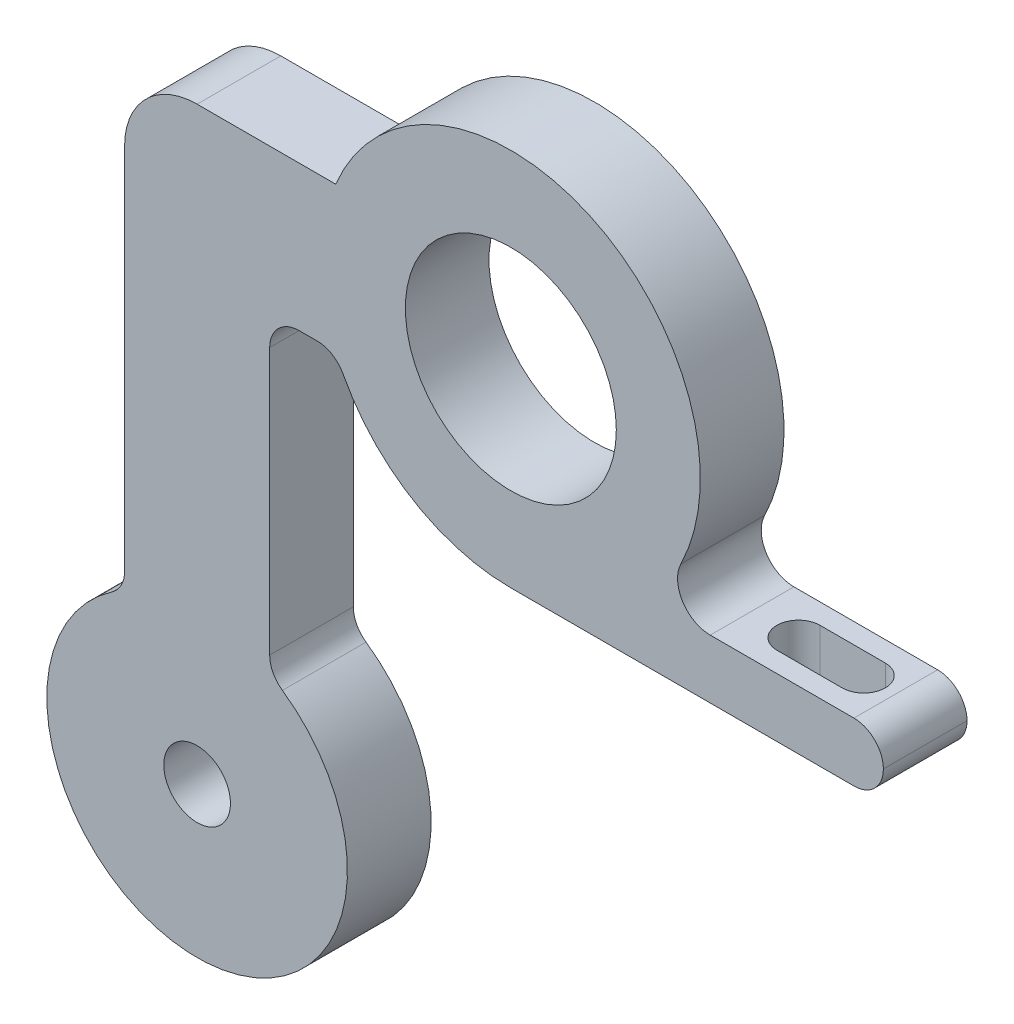
ISO-10303-21;
HEADER;
FILE_DESCRIPTION(('STEP AP214'),'2;1');
FILE_NAME('part.step','',(''),(''),'','','');
FILE_SCHEMA(('AUTOMOTIVE_DESIGN { 1 0 10303 214 1 1 1 1 }'));
ENDSEC;
DATA;
#1=APPLICATION_CONTEXT('core data for automotive mechanical design processes');
#2=APPLICATION_PROTOCOL_DEFINITION('international standard','automotive_design',2000,#1);
#3=PRODUCT_CONTEXT('',#1,'mechanical');
#4=PRODUCT('Part','Part','',(#3));
#5=PRODUCT_RELATED_PRODUCT_CATEGORY('part','',(#4));
#6=PRODUCT_DEFINITION_FORMATION('','',#4);
#7=PRODUCT_DEFINITION_CONTEXT('part definition',#1,'design');
#8=PRODUCT_DEFINITION('design','',#6,#7);
#9=PRODUCT_DEFINITION_SHAPE('','',#8);
#10=(LENGTH_UNIT() NAMED_UNIT(*) SI_UNIT(.MILLI.,.METRE.));
#11=(NAMED_UNIT(*) PLANE_ANGLE_UNIT() SI_UNIT($,.RADIAN.));
#12=(NAMED_UNIT(*) SI_UNIT($,.STERADIAN.) SOLID_ANGLE_UNIT());
#13=UNCERTAINTY_MEASURE_WITH_UNIT(LENGTH_MEASURE(1.E-05),#10,'distance_accuracy_value','');
#14=(GEOMETRIC_REPRESENTATION_CONTEXT(3) GLOBAL_UNCERTAINTY_ASSIGNED_CONTEXT((#13)) GLOBAL_UNIT_ASSIGNED_CONTEXT((#10,
#11,#12)) REPRESENTATION_CONTEXT('',''));
#15=CARTESIAN_POINT('',(0.,0.,0.));
#16=DIRECTION('',(0.,0.,1.));
#17=DIRECTION('',(1.,0.,0.));
#18=AXIS2_PLACEMENT_3D('',#15,#16,#17);
#19=CARTESIAN_POINT('',(0.,0.,6.4));
#20=DIRECTION('',(0.,0.,-1.));
#21=DIRECTION('',(-1.,0.,0.));
#22=AXIS2_PLACEMENT_3D('',#19,#20,#21);
#23=CYLINDRICAL_SURFACE('',#22,11.5);
#24=CARTESIAN_POINT('',(0.,0.,6.4));
#25=DIRECTION('',(0.,0.,1.));
#26=DIRECTION('',(1.,0.,0.));
#27=AXIS2_PLACEMENT_3D('',#24,#25,#26);
#28=CIRCLE('',#27,11.5);
#29=CARTESIAN_POINT('',(-6.52363636363636,9.47059494409096,6.4));
#30=VERTEX_POINT('',#29);
#31=CARTESIAN_POINT('',(6.52363636363636,9.47059494409096,6.4));
#32=VERTEX_POINT('',#31);
#33=EDGE_CURVE('E223',#30,#32,#28,.T.);
#34=ORIENTED_EDGE('',*,*,#33,.F.);
#35=DIRECTION('',(0.,0.,-1.));
#36=VECTOR('',#35,1.);
#37=CARTESIAN_POINT('',(-6.52363636363636,9.47059494409096,6.4));
#38=LINE('',#37,#36);
#39=CARTESIAN_POINT('',(-6.52363636363636,9.47059494409096,0.));
#40=VERTEX_POINT('',#39);
#41=EDGE_CURVE('E312',#30,#40,#38,.T.);
#42=ORIENTED_EDGE('',*,*,#41,.T.);
#43=CARTESIAN_POINT('',(0.,0.,0.));
#44=DIRECTION('',(0.,0.,1.));
#45=DIRECTION('',(1.,0.,0.));
#46=AXIS2_PLACEMENT_3D('',#43,#44,#45);
#47=CIRCLE('',#46,11.5);
#48=CARTESIAN_POINT('',(6.52363636363636,9.47059494409096,0.));
#49=VERTEX_POINT('',#48);
#50=EDGE_CURVE('E254',#40,#49,#47,.T.);
#51=ORIENTED_EDGE('',*,*,#50,.T.);
#52=DIRECTION('',(0.,0.,-1.));
#53=VECTOR('',#52,1.);
#54=CARTESIAN_POINT('',(6.52363636363636,9.47059494409096,6.4));
#55=LINE('',#54,#53);
#56=EDGE_CURVE('E310',#49,#32,#55,.F.);
#57=ORIENTED_EDGE('',*,*,#56,.T.);
#58=EDGE_LOOP('',(#34,#42,#51,#57));
#59=FACE_BOUND('',#58,.T.);
#60=ADVANCED_FACE('F34',(#59),#23,.T.);
#61=CARTESIAN_POINT('',(5.55,0.,6.4));
#62=DIRECTION('',(-1.,0.,0.));
#63=DIRECTION('',(0.,-1.,0.));
#64=AXIS2_PLACEMENT_3D('',#61,#62,#63);
#65=PLANE('',#64);
#66=DIRECTION('',(0.,1.,0.));
#67=VECTOR('',#66,1.);
#68=CARTESIAN_POINT('',(5.55,0.,6.4));
#69=LINE('',#68,#67);
#70=CARTESIAN_POINT('',(5.55,11.3235374331522,6.4));
#71=VERTEX_POINT('',#70);
#72=CARTESIAN_POINT('',(5.55,31.7,6.4));
#73=VERTEX_POINT('',#72);
#74=EDGE_CURVE('E227',#71,#73,#69,.T.);
#75=ORIENTED_EDGE('',*,*,#74,.F.);
#76=DIRECTION('',(0.,0.,1.));
#77=VECTOR('',#76,1.);
#78=CARTESIAN_POINT('',(5.55,11.3235374331522,0.));
#79=LINE('',#78,#77);
#80=CARTESIAN_POINT('',(5.55,11.3235374331522,0.));
#81=VERTEX_POINT('',#80);
#82=EDGE_CURVE('E319',#71,#81,#79,.F.);
#83=ORIENTED_EDGE('',*,*,#82,.T.);
#84=DIRECTION('',(0.,1.,0.));
#85=VECTOR('',#84,1.);
#86=CARTESIAN_POINT('',(5.55,0.,0.));
#87=LINE('',#86,#85);
#88=CARTESIAN_POINT('',(5.55,31.7,0.));
#89=VERTEX_POINT('',#88);
#90=EDGE_CURVE('E257',#81,#89,#87,.T.);
#91=ORIENTED_EDGE('',*,*,#90,.T.);
#92=DIRECTION('',(0.,0.,-1.));
#93=VECTOR('',#92,1.);
#94=CARTESIAN_POINT('',(5.55,31.7,6.4));
#95=LINE('',#94,#93);
#96=EDGE_CURVE('E317',#89,#73,#95,.F.);
#97=ORIENTED_EDGE('',*,*,#96,.T.);
#98=EDGE_LOOP('',(#75,#83,#91,#97));
#99=FACE_BOUND('',#98,.T.);
#100=ADVANCED_FACE('F355',(#99),#65,.F.);
#101=CARTESIAN_POINT('',(0.,33.95,6.4));
#102=DIRECTION('',(0.,1.,0.));
#103=DIRECTION('',(0.,0.,1.));
#104=AXIS2_PLACEMENT_3D('',#101,#102,#103);
#105=PLANE('',#104);
#106=DIRECTION('',(1.,0.,0.));
#107=VECTOR('',#106,1.);
#108=CARTESIAN_POINT('',(0.,33.95,0.));
#109=LINE('',#108,#107);
#110=CARTESIAN_POINT('',(7.8,33.95,0.));
#111=VERTEX_POINT('',#110);
#112=CARTESIAN_POINT('',(9.17696050062606,33.95,0.));
#113=VERTEX_POINT('',#112);
#114=EDGE_CURVE('E260',#111,#113,#109,.T.);
#115=ORIENTED_EDGE('',*,*,#114,.T.);
#116=DIRECTION('',(0.,0.,1.));
#117=VECTOR('',#116,1.);
#118=CARTESIAN_POINT('',(9.17696050062606,33.95,6.4));
#119=LINE('',#118,#117);
#120=CARTESIAN_POINT('',(9.17696050062606,33.95,6.4));
#121=VERTEX_POINT('',#120);
#122=EDGE_CURVE('E308',#113,#121,#119,.T.);
#123=ORIENTED_EDGE('',*,*,#122,.T.);
#124=DIRECTION('',(1.,0.,0.));
#125=VECTOR('',#124,1.);
#126=CARTESIAN_POINT('',(0.,33.95,6.4));
#127=LINE('',#126,#125);
#128=CARTESIAN_POINT('',(7.8,33.95,6.4));
#129=VERTEX_POINT('',#128);
#130=EDGE_CURVE('E230',#129,#121,#127,.T.);
#131=ORIENTED_EDGE('',*,*,#130,.F.);
#132=DIRECTION('',(0.,0.,-1.));
#133=VECTOR('',#132,1.);
#134=CARTESIAN_POINT('',(7.8,33.95,0.));
#135=LINE('',#134,#133);
#136=EDGE_CURVE('E305',#129,#111,#135,.T.);
#137=ORIENTED_EDGE('',*,*,#136,.T.);
#138=EDGE_LOOP('',(#115,#123,#131,#137));
#139=FACE_BOUND('',#138,.T.);
#140=ADVANCED_FACE('F364',(#139),#105,.F.);
#141=CARTESIAN_POINT('',(24.,39.5,6.4));
#142=DIRECTION('',(0.,0.,-1.));
#143=DIRECTION('',(-1.,0.,0.));
#144=AXIS2_PLACEMENT_3D('',#141,#142,#143);
#145=CYLINDRICAL_SURFACE('',#144,14.5);
#146=CARTESIAN_POINT('',(24.,39.5,6.4));
#147=DIRECTION('',(0.,0.,1.));
#148=DIRECTION('',(1.,0.,0.));
#149=AXIS2_PLACEMENT_3D('',#146,#147,#148);
#150=CIRCLE('',#149,14.5);
#151=CARTESIAN_POINT('',(11.1681150602435,32.7477611940298,6.4));
#152=VERTEX_POINT('',#151);
#153=CARTESIAN_POINT('',(24.,25.,6.4));
#154=VERTEX_POINT('',#153);
#155=EDGE_CURVE('E233',#152,#154,#150,.T.);
#156=ORIENTED_EDGE('',*,*,#155,.F.);
#157=DIRECTION('',(0.,0.,-1.));
#158=VECTOR('',#157,1.);
#159=CARTESIAN_POINT('',(11.1681150602435,32.7477611940298,6.4));
#160=LINE('',#159,#158);
#161=CARTESIAN_POINT('',(11.1681150602435,32.7477611940298,0.));
#162=VERTEX_POINT('',#161);
#163=EDGE_CURVE('E302',#152,#162,#160,.T.);
#164=ORIENTED_EDGE('',*,*,#163,.T.);
#165=CARTESIAN_POINT('',(24.,39.5,0.));
#166=DIRECTION('',(0.,0.,1.));
#167=DIRECTION('',(1.,0.,0.));
#168=AXIS2_PLACEMENT_3D('',#165,#166,#167);
#169=CIRCLE('',#168,14.5);
#170=CARTESIAN_POINT('',(24.,25.,0.));
#171=VERTEX_POINT('',#170);
#172=EDGE_CURVE('E263',#162,#171,#169,.T.);
#173=ORIENTED_EDGE('',*,*,#172,.T.);
#174=DIRECTION('',(0.,0.,-1.));
#175=VECTOR('',#174,1.);
#176=CARTESIAN_POINT('',(24.,25.,6.4));
#177=LINE('',#176,#175);
#178=EDGE_CURVE('E288',#154,#171,#177,.T.);
#179=ORIENTED_EDGE('',*,*,#178,.F.);
#180=EDGE_LOOP('',(#156,#164,#173,#179));
#181=FACE_BOUND('',#180,.T.);
#182=ADVANCED_FACE('F372',(#181),#145,.T.);
#183=CARTESIAN_POINT('',(0.,25.,6.4));
#184=DIRECTION('',(0.,1.,0.));
#185=DIRECTION('',(0.,0.,1.));
#186=AXIS2_PLACEMENT_3D('',#183,#184,#185);
#187=PLANE('',#186);
#188=DIRECTION('',(-1.,0.,0.));
#189=VECTOR('',#188,1.);
#190=CARTESIAN_POINT('',(0.,25.,1.55000000000001));
#191=LINE('',#190,#189);
#192=CARTESIAN_POINT('',(47.8,25.,1.55));
#193=VERTEX_POINT('',#192);
#194=CARTESIAN_POINT('',(42.8,25.,1.55));
#195=VERTEX_POINT('',#194);
#196=EDGE_CURVE('E213',#193,#195,#191,.T.);
#197=ORIENTED_EDGE('',*,*,#196,.T.);
#198=CARTESIAN_POINT('',(42.8,25.,3.2));
#199=DIRECTION('',(0.,1.,0.));
#200=DIRECTION('',(0.,0.,1.));
#201=AXIS2_PLACEMENT_3D('',#198,#199,#200);
#202=CIRCLE('',#201,1.65);
#203=CARTESIAN_POINT('',(42.8,25.,4.85));
#204=VERTEX_POINT('',#203);
#205=EDGE_CURVE('E216',#195,#204,#202,.T.);
#206=ORIENTED_EDGE('',*,*,#205,.T.);
#207=DIRECTION('',(1.,0.,0.));
#208=VECTOR('',#207,1.);
#209=CARTESIAN_POINT('',(0.,25.,4.85000000000001));
#210=LINE('',#209,#208);
#211=CARTESIAN_POINT('',(47.8,25.,4.85));
#212=VERTEX_POINT('',#211);
#213=EDGE_CURVE('E208',#204,#212,#210,.T.);
#214=ORIENTED_EDGE('',*,*,#213,.T.);
#215=CARTESIAN_POINT('',(47.8,25.,3.2));
#216=DIRECTION('',(0.,1.,0.));
#217=DIRECTION('',(0.,0.,1.));
#218=AXIS2_PLACEMENT_3D('',#215,#216,#217);
#219=CIRCLE('',#218,1.65);
#220=EDGE_CURVE('E183',#212,#193,#219,.T.);
#221=ORIENTED_EDGE('',*,*,#220,.T.);
#222=EDGE_LOOP('',(#197,#206,#214,#221));
#223=FACE_BOUND('',#222,.T.);
#224=DIRECTION('',(1.,0.,0.));
#225=VECTOR('',#224,1.);
#226=CARTESIAN_POINT('',(0.,25.,0.));
#227=LINE('',#226,#225);
#228=CARTESIAN_POINT('',(50.25,25.,0.));
#229=VERTEX_POINT('',#228);
#230=EDGE_CURVE('E265',#171,#229,#227,.T.);
#231=ORIENTED_EDGE('',*,*,#230,.T.);
#232=DIRECTION('',(0.,0.,-1.));
#233=VECTOR('',#232,1.);
#234=CARTESIAN_POINT('',(50.25,25.,6.4));
#235=LINE('',#234,#233);
#236=CARTESIAN_POINT('',(50.25,25.,6.4));
#237=VERTEX_POINT('',#236);
#238=EDGE_CURVE('E326',#229,#237,#235,.F.);
#239=ORIENTED_EDGE('',*,*,#238,.T.);
#240=DIRECTION('',(1.,0.,0.));
#241=VECTOR('',#240,1.);
#242=CARTESIAN_POINT('',(0.,25.,6.4));
#243=LINE('',#242,#241);
#244=EDGE_CURVE('E235',#154,#237,#243,.T.);
#245=ORIENTED_EDGE('',*,*,#244,.F.);
#246=ORIENTED_EDGE('',*,*,#178,.T.);
#247=EDGE_LOOP('',(#231,#239,#245,#246));
#248=FACE_BOUND('',#247,.T.);
#249=ADVANCED_FACE('F377',(#223,#248),#187,.F.);
#250=CARTESIAN_POINT('',(0.,29.5,6.4));
#251=DIRECTION('',(0.,-1.,0.));
#252=DIRECTION('',(1.,0.,0.));
#253=AXIS2_PLACEMENT_3D('',#250,#251,#252);
#254=PLANE('',#253);
#255=DIRECTION('',(1.,0.,0.));
#256=VECTOR('',#255,1.);
#257=CARTESIAN_POINT('',(42.8,29.5,4.85));
#258=LINE('',#257,#256);
#259=CARTESIAN_POINT('',(42.8,29.5,4.85));
#260=VERTEX_POINT('',#259);
#261=CARTESIAN_POINT('',(47.8,29.5,4.85));
#262=VERTEX_POINT('',#261);
#263=EDGE_CURVE('E191',#260,#262,#258,.T.);
#264=ORIENTED_EDGE('',*,*,#263,.F.);
#265=CARTESIAN_POINT('',(42.8,29.5,3.2));
#266=DIRECTION('',(0.,1.,0.));
#267=DIRECTION('',(-1.,0.,0.));
#268=AXIS2_PLACEMENT_3D('',#265,#266,#267);
#269=CIRCLE('',#268,1.65);
#270=CARTESIAN_POINT('',(42.8,29.5,1.55));
#271=VERTEX_POINT('',#270);
#272=EDGE_CURVE('E196',#271,#260,#269,.T.);
#273=ORIENTED_EDGE('',*,*,#272,.F.);
#274=DIRECTION('',(-1.,0.,0.));
#275=VECTOR('',#274,1.);
#276=CARTESIAN_POINT('',(42.8,29.5,1.55));
#277=LINE('',#276,#275);
#278=CARTESIAN_POINT('',(47.8,29.5,1.55));
#279=VERTEX_POINT('',#278);
#280=EDGE_CURVE('E201',#279,#271,#277,.T.);
#281=ORIENTED_EDGE('',*,*,#280,.F.);
#282=CARTESIAN_POINT('',(47.8,29.5,3.2));
#283=DIRECTION('',(0.,1.,0.));
#284=DIRECTION('',(-1.,0.,0.));
#285=AXIS2_PLACEMENT_3D('',#282,#283,#284);
#286=CIRCLE('',#285,1.65);
#287=EDGE_CURVE('E180',#262,#279,#286,.T.);
#288=ORIENTED_EDGE('',*,*,#287,.F.);
#289=EDGE_LOOP('',(#264,#273,#281,#288));
#290=FACE_BOUND('',#289,.T.);
#291=DIRECTION('',(-1.,0.,0.));
#292=VECTOR('',#291,1.);
#293=CARTESIAN_POINT('',(0.,29.5,6.4));
#294=LINE('',#293,#292);
#295=CARTESIAN_POINT('',(50.25,29.5,6.4));
#296=VERTEX_POINT('',#295);
#297=CARTESIAN_POINT('',(39.2561463023924,29.5,6.4));
#298=VERTEX_POINT('',#297);
#299=EDGE_CURVE('E238',#296,#298,#294,.T.);
#300=ORIENTED_EDGE('',*,*,#299,.F.);
#301=DIRECTION('',(0.,0.,-1.));
#302=VECTOR('',#301,1.);
#303=CARTESIAN_POINT('',(50.25,29.5,6.4));
#304=LINE('',#303,#302);
#305=CARTESIAN_POINT('',(50.25,29.5,0.));
#306=VERTEX_POINT('',#305);
#307=EDGE_CURVE('E331',#296,#306,#304,.T.);
#308=ORIENTED_EDGE('',*,*,#307,.T.);
#309=DIRECTION('',(-1.,0.,0.));
#310=VECTOR('',#309,1.);
#311=CARTESIAN_POINT('',(0.,29.5,0.));
#312=LINE('',#311,#310);
#313=CARTESIAN_POINT('',(39.2561463023924,29.5,0.));
#314=VERTEX_POINT('',#313);
#315=EDGE_CURVE('E269',#306,#314,#312,.T.);
#316=ORIENTED_EDGE('',*,*,#315,.T.);
#317=DIRECTION('',(0.,0.,1.));
#318=VECTOR('',#317,1.);
#319=CARTESIAN_POINT('',(39.2561463023924,29.5,6.4));
#320=LINE('',#319,#318);
#321=EDGE_CURVE('E294',#314,#298,#320,.T.);
#322=ORIENTED_EDGE('',*,*,#321,.T.);
#323=EDGE_LOOP('',(#300,#308,#316,#322));
#324=FACE_BOUND('',#323,.T.);
#325=ADVANCED_FACE('F198',(#290,#324),#254,.F.);
#326=CARTESIAN_POINT('',(37.0125953755699,33.1029411764706,6.4));
#327=VERTEX_POINT('',#326);
#328=CARTESIAN_POINT('',(10.6041984189075,45.05,6.4));
#329=VERTEX_POINT('',#328);
#330=EDGE_CURVE('E236',#327,#329,#150,.T.);
#331=ORIENTED_EDGE('',*,*,#330,.F.);
#332=DIRECTION('',(0.,0.,-1.));
#333=VECTOR('',#332,1.);
#334=CARTESIAN_POINT('',(37.0125953755699,33.1029411764706,6.4));
#335=LINE('',#334,#333);
#336=CARTESIAN_POINT('',(37.0125953755699,33.1029411764706,0.));
#337=VERTEX_POINT('',#336);
#338=EDGE_CURVE('E291',#327,#337,#335,.T.);
#339=ORIENTED_EDGE('',*,*,#338,.T.);
#340=CARTESIAN_POINT('',(10.6041984189075,45.05,0.));
#341=VERTEX_POINT('',#340);
#342=EDGE_CURVE('E266',#337,#341,#169,.T.);
#343=ORIENTED_EDGE('',*,*,#342,.T.);
#344=DIRECTION('',(0.,0.,-1.));
#345=VECTOR('',#344,1.);
#346=CARTESIAN_POINT('',(10.6041984189075,45.05,6.4));
#347=LINE('',#346,#345);
#348=EDGE_CURVE('E285',#329,#341,#347,.T.);
#349=ORIENTED_EDGE('',*,*,#348,.F.);
#350=EDGE_LOOP('',(#331,#339,#343,#349));
#351=FACE_BOUND('',#350,.T.);
#352=ADVANCED_FACE('F398',(#351),#145,.T.);
#353=CARTESIAN_POINT('',(0.,45.05,6.4));
#354=DIRECTION('',(0.,1.,0.));
#355=DIRECTION('',(0.,0.,1.));
#356=AXIS2_PLACEMENT_3D('',#353,#354,#355);
#357=PLANE('',#356);
#358=DIRECTION('',(1.,0.,0.));
#359=VECTOR('',#358,1.);
#360=CARTESIAN_POINT('',(0.,45.05,0.));
#361=LINE('',#360,#359);
#362=CARTESIAN_POINT('',(0.,45.05,0.));
#363=VERTEX_POINT('',#362);
#364=EDGE_CURVE('E271',#363,#341,#361,.T.);
#365=ORIENTED_EDGE('',*,*,#364,.F.);
#366=DIRECTION('',(0.,0.,-1.));
#367=VECTOR('',#366,1.);
#368=CARTESIAN_POINT('',(0.,45.05,6.4));
#369=LINE('',#368,#367);
#370=CARTESIAN_POINT('',(0.,45.05,6.4));
#371=VERTEX_POINT('',#370);
#372=EDGE_CURVE('E283',#371,#363,#369,.T.);
#373=ORIENTED_EDGE('',*,*,#372,.F.);
#374=DIRECTION('',(1.,0.,0.));
#375=VECTOR('',#374,1.);
#376=CARTESIAN_POINT('',(0.,45.05,6.4));
#377=LINE('',#376,#375);
#378=EDGE_CURVE('E240',#371,#329,#377,.T.);
#379=ORIENTED_EDGE('',*,*,#378,.T.);
#380=ORIENTED_EDGE('',*,*,#348,.T.);
#381=EDGE_LOOP('',(#365,#373,#379,#380));
#382=FACE_BOUND('',#381,.T.);
#383=ADVANCED_FACE('F450',(#382),#357,.T.);
#384=CARTESIAN_POINT('',(0.,39.5,6.4));
#385=DIRECTION('',(0.,0.,-1.));
#386=DIRECTION('',(-1.,0.,0.));
#387=AXIS2_PLACEMENT_3D('',#384,#385,#386);
#388=CYLINDRICAL_SURFACE('',#387,5.55);
#389=CARTESIAN_POINT('',(0.,39.5,0.));
#390=DIRECTION('',(0.,0.,1.));
#391=DIRECTION('',(1.,0.,0.));
#392=AXIS2_PLACEMENT_3D('',#389,#390,#391);
#393=CIRCLE('',#392,5.55);
#394=CARTESIAN_POINT('',(-5.55,39.5,0.));
#395=VERTEX_POINT('',#394);
#396=EDGE_CURVE('E274',#363,#395,#393,.T.);
#397=ORIENTED_EDGE('',*,*,#396,.T.);
#398=DIRECTION('',(0.,0.,-1.));
#399=VECTOR('',#398,1.);
#400=CARTESIAN_POINT('',(-5.55,39.5,6.4));
#401=LINE('',#400,#399);
#402=CARTESIAN_POINT('',(-5.55,39.5,6.4));
#403=VERTEX_POINT('',#402);
#404=EDGE_CURVE('E251',#403,#395,#401,.T.);
#405=ORIENTED_EDGE('',*,*,#404,.F.);
#406=CARTESIAN_POINT('',(0.,39.5,6.4));
#407=DIRECTION('',(0.,0.,1.));
#408=DIRECTION('',(1.,0.,0.));
#409=AXIS2_PLACEMENT_3D('',#406,#407,#408);
#410=CIRCLE('',#409,5.55);
#411=EDGE_CURVE('E243',#371,#403,#410,.T.);
#412=ORIENTED_EDGE('',*,*,#411,.F.);
#413=ORIENTED_EDGE('',*,*,#372,.T.);
#414=EDGE_LOOP('',(#397,#405,#412,#413));
#415=FACE_BOUND('',#414,.T.);
#416=ADVANCED_FACE('F456',(#415),#388,.T.);
#417=CARTESIAN_POINT('',(-5.55,0.,6.4));
#418=DIRECTION('',(-1.,0.,0.));
#419=DIRECTION('',(0.,-1.,0.));
#420=AXIS2_PLACEMENT_3D('',#417,#418,#419);
#421=PLANE('',#420);
#422=DIRECTION('',(0.,1.,0.));
#423=VECTOR('',#422,1.);
#424=CARTESIAN_POINT('',(-5.55,0.,0.));
#425=LINE('',#424,#423);
#426=CARTESIAN_POINT('',(-5.55,11.3235374331522,0.));
#427=VERTEX_POINT('',#426);
#428=EDGE_CURVE('E277',#427,#395,#425,.T.);
#429=ORIENTED_EDGE('',*,*,#428,.F.);
#430=DIRECTION('',(0.,0.,-1.));
#431=VECTOR('',#430,1.);
#432=CARTESIAN_POINT('',(-5.55,11.3235374331522,6.4));
#433=LINE('',#432,#431);
#434=CARTESIAN_POINT('',(-5.55,11.3235374331522,6.4));
#435=VERTEX_POINT('',#434);
#436=EDGE_CURVE('E315',#427,#435,#433,.F.);
#437=ORIENTED_EDGE('',*,*,#436,.T.);
#438=DIRECTION('',(0.,1.,0.));
#439=VECTOR('',#438,1.);
#440=CARTESIAN_POINT('',(-5.55,0.,6.4));
#441=LINE('',#440,#439);
#442=EDGE_CURVE('E246',#435,#403,#441,.T.);
#443=ORIENTED_EDGE('',*,*,#442,.T.);
#444=ORIENTED_EDGE('',*,*,#404,.T.);
#445=EDGE_LOOP('',(#429,#437,#443,#444));
#446=FACE_BOUND('',#445,.T.);
#447=ADVANCED_FACE('F415',(#446),#421,.T.);
#448=CARTESIAN_POINT('',(24.,39.5,6.4));
#449=DIRECTION('',(0.,0.,-1.));
#450=DIRECTION('',(-1.,0.,0.));
#451=AXIS2_PLACEMENT_3D('',#448,#449,#450);
#452=CYLINDRICAL_SURFACE('',#451,8.07);
#453=CARTESIAN_POINT('',(24.,39.5,6.4));
#454=DIRECTION('',(0.,0.,1.));
#455=DIRECTION('',(1.,0.,0.));
#456=AXIS2_PLACEMENT_3D('',#453,#454,#455);
#457=CIRCLE('',#456,8.07);
#458=CARTESIAN_POINT('',(32.07,39.5,6.4));
#459=VERTEX_POINT('',#458);
#460=EDGE_CURVE('E220',#459,#459,#457,.T.);
#461=ORIENTED_EDGE('',*,*,#460,.T.);
#462=EDGE_LOOP('',(#461));
#463=FACE_BOUND('',#462,.T.);
#464=CARTESIAN_POINT('',(24.,39.5,0.));
#465=DIRECTION('',(0.,0.,1.));
#466=DIRECTION('',(1.,0.,0.));
#467=AXIS2_PLACEMENT_3D('',#464,#465,#466);
#468=CIRCLE('',#467,8.07);
#469=CARTESIAN_POINT('',(32.07,39.5,0.));
#470=VERTEX_POINT('',#469);
#471=EDGE_CURVE('E219',#470,#470,#468,.T.);
#472=ORIENTED_EDGE('',*,*,#471,.F.);
#473=EDGE_LOOP('',(#472));
#474=FACE_BOUND('',#473,.T.);
#475=ADVANCED_FACE('F411',(#463,#474),#452,.F.);
#476=CARTESIAN_POINT('',(0.,0.,6.4));
#477=DIRECTION('',(0.,0.,-1.));
#478=DIRECTION('',(-1.,0.,0.));
#479=AXIS2_PLACEMENT_3D('',#476,#477,#478);
#480=CYLINDRICAL_SURFACE('',#479,2.55);
#481=CARTESIAN_POINT('',(0.,0.,6.4));
#482=DIRECTION('',(0.,0.,1.));
#483=DIRECTION('',(1.,0.,0.));
#484=AXIS2_PLACEMENT_3D('',#481,#482,#483);
#485=CIRCLE('',#484,2.55);
#486=CARTESIAN_POINT('',(2.55,0.,6.4));
#487=VERTEX_POINT('',#486);
#488=EDGE_CURVE('E248',#487,#487,#485,.T.);
#489=ORIENTED_EDGE('',*,*,#488,.T.);
#490=EDGE_LOOP('',(#489));
#491=FACE_BOUND('',#490,.T.);
#492=CARTESIAN_POINT('',(0.,0.,0.));
#493=DIRECTION('',(0.,0.,1.));
#494=DIRECTION('',(1.,0.,0.));
#495=AXIS2_PLACEMENT_3D('',#492,#493,#494);
#496=CIRCLE('',#495,2.55);
#497=CARTESIAN_POINT('',(2.55,0.,0.));
#498=VERTEX_POINT('',#497);
#499=EDGE_CURVE('E224',#498,#498,#496,.T.);
#500=ORIENTED_EDGE('',*,*,#499,.F.);
#501=EDGE_LOOP('',(#500));
#502=FACE_BOUND('',#501,.T.);
#503=ADVANCED_FACE('F414',(#491,#502),#480,.F.);
#504=CARTESIAN_POINT('',(0.,0.,6.4));
#505=DIRECTION('',(0.,0.,1.));
#506=DIRECTION('',(1.,0.,0.));
#507=AXIS2_PLACEMENT_3D('',#504,#505,#506);
#508=PLANE('',#507);
#509=ORIENTED_EDGE('',*,*,#460,.F.);
#510=EDGE_LOOP('',(#509));
#511=FACE_BOUND('',#510,.T.);
#512=ORIENTED_EDGE('',*,*,#244,.T.);
#513=CARTESIAN_POINT('',(50.25,27.25,6.4));
#514=DIRECTION('',(0.,0.,1.));
#515=DIRECTION('',(1.,0.,0.));
#516=AXIS2_PLACEMENT_3D('',#513,#514,#515);
#517=CIRCLE('',#516,2.25);
#518=CARTESIAN_POINT('',(52.5,27.25,6.4));
#519=VERTEX_POINT('',#518);
#520=EDGE_CURVE('E55',#237,#519,#517,.T.);
#521=ORIENTED_EDGE('',*,*,#520,.T.);
#522=CARTESIAN_POINT('',(50.25,27.25,6.4));
#523=DIRECTION('',(0.,0.,1.));
#524=DIRECTION('',(1.,0.,0.));
#525=AXIS2_PLACEMENT_3D('',#522,#523,#524);
#526=CIRCLE('',#525,2.25);
#527=EDGE_CURVE('E50',#519,#296,#526,.T.);
#528=ORIENTED_EDGE('',*,*,#527,.T.);
#529=ORIENTED_EDGE('',*,*,#299,.T.);
#530=CARTESIAN_POINT('',(39.2561463023924,32.,6.4));
#531=DIRECTION('',(0.,0.,1.));
#532=DIRECTION('',(1.,0.,0.));
#533=AXIS2_PLACEMENT_3D('',#530,#531,#532);
#534=CIRCLE('',#533,2.5);
#535=EDGE_CURVE('E300',#298,#327,#534,.F.);
#536=ORIENTED_EDGE('',*,*,#535,.T.);
#537=ORIENTED_EDGE('',*,*,#330,.T.);
#538=ORIENTED_EDGE('',*,*,#378,.F.);
#539=ORIENTED_EDGE('',*,*,#411,.T.);
#540=ORIENTED_EDGE('',*,*,#442,.F.);
#541=CARTESIAN_POINT('',(-7.8,11.3235374331522,6.4));
#542=DIRECTION('',(0.,0.,1.));
#543=DIRECTION('',(1.,0.,0.));
#544=AXIS2_PLACEMENT_3D('',#541,#542,#543);
#545=CIRCLE('',#544,2.25);
#546=EDGE_CURVE('E339',#435,#30,#545,.F.);
#547=ORIENTED_EDGE('',*,*,#546,.T.);
#548=ORIENTED_EDGE('',*,*,#33,.T.);
#549=CARTESIAN_POINT('',(7.8,11.3235374331522,6.4));
#550=DIRECTION('',(0.,0.,1.));
#551=DIRECTION('',(1.,0.,0.));
#552=AXIS2_PLACEMENT_3D('',#549,#550,#551);
#553=CIRCLE('',#552,2.25);
#554=EDGE_CURVE('E343',#32,#71,#553,.F.);
#555=ORIENTED_EDGE('',*,*,#554,.T.);
#556=ORIENTED_EDGE('',*,*,#74,.T.);
#557=CARTESIAN_POINT('',(7.8,31.7,6.4));
#558=DIRECTION('',(0.,0.,1.));
#559=DIRECTION('',(1.,0.,0.));
#560=AXIS2_PLACEMENT_3D('',#557,#558,#559);
#561=CIRCLE('',#560,2.25);
#562=EDGE_CURVE('E11',#73,#129,#561,.F.);
#563=ORIENTED_EDGE('',*,*,#562,.T.);
#564=ORIENTED_EDGE('',*,*,#130,.T.);
#565=CARTESIAN_POINT('',(9.17696050062606,31.7,6.4));
#566=DIRECTION('',(0.,0.,1.));
#567=DIRECTION('',(1.,0.,0.));
#568=AXIS2_PLACEMENT_3D('',#565,#566,#567);
#569=CIRCLE('',#568,2.25);
#570=EDGE_CURVE('E335',#121,#152,#569,.F.);
#571=ORIENTED_EDGE('',*,*,#570,.T.);
#572=ORIENTED_EDGE('',*,*,#155,.T.);
#573=EDGE_LOOP('',(#512,#521,#528,#529,#536,#537,#538,#539,#540,#547,#548,#555,#556,#563,#564,
#571,#572));
#574=FACE_BOUND('',#573,.T.);
#575=ORIENTED_EDGE('',*,*,#488,.F.);
#576=EDGE_LOOP('',(#575));
#577=FACE_BOUND('',#576,.T.);
#578=ADVANCED_FACE('F360',(#511,#574,#577),#508,.T.);
#579=CARTESIAN_POINT('',(0.,0.,0.));
#580=DIRECTION('',(0.,0.,1.));
#581=DIRECTION('',(1.,0.,0.));
#582=AXIS2_PLACEMENT_3D('',#579,#580,#581);
#583=PLANE('',#582);
#584=ORIENTED_EDGE('',*,*,#471,.T.);
#585=EDGE_LOOP('',(#584));
#586=FACE_BOUND('',#585,.T.);
#587=CARTESIAN_POINT('',(50.25,27.25,0.));
#588=DIRECTION('',(0.,0.,1.));
#589=DIRECTION('',(1.,0.,0.));
#590=AXIS2_PLACEMENT_3D('',#587,#588,#589);
#591=CIRCLE('',#590,2.25);
#592=CARTESIAN_POINT('',(52.5,27.25,0.));
#593=VERTEX_POINT('',#592);
#594=EDGE_CURVE('E322',#306,#593,#591,.F.);
#595=ORIENTED_EDGE('',*,*,#594,.T.);
#596=CARTESIAN_POINT('',(50.25,27.25,0.));
#597=DIRECTION('',(0.,0.,1.));
#598=DIRECTION('',(1.,0.,0.));
#599=AXIS2_PLACEMENT_3D('',#596,#597,#598);
#600=CIRCLE('',#599,2.25);
#601=EDGE_CURVE('E324',#593,#229,#600,.F.);
#602=ORIENTED_EDGE('',*,*,#601,.T.);
#603=ORIENTED_EDGE('',*,*,#230,.F.);
#604=ORIENTED_EDGE('',*,*,#172,.F.);
#605=CARTESIAN_POINT('',(9.17696050062606,31.7,0.));
#606=DIRECTION('',(0.,0.,1.));
#607=DIRECTION('',(1.,0.,0.));
#608=AXIS2_PLACEMENT_3D('',#605,#606,#607);
#609=CIRCLE('',#608,2.25);
#610=EDGE_CURVE('E333',#162,#113,#609,.T.);
#611=ORIENTED_EDGE('',*,*,#610,.T.);
#612=ORIENTED_EDGE('',*,*,#114,.F.);
#613=CARTESIAN_POINT('',(7.8,31.7,0.));
#614=DIRECTION('',(0.,0.,1.));
#615=DIRECTION('',(1.,0.,0.));
#616=AXIS2_PLACEMENT_3D('',#613,#614,#615);
#617=CIRCLE('',#616,2.25);
#618=EDGE_CURVE('E43',#111,#89,#617,.T.);
#619=ORIENTED_EDGE('',*,*,#618,.T.);
#620=ORIENTED_EDGE('',*,*,#90,.F.);
#621=CARTESIAN_POINT('',(7.8,11.3235374331522,0.));
#622=DIRECTION('',(0.,0.,1.));
#623=DIRECTION('',(1.,0.,0.));
#624=AXIS2_PLACEMENT_3D('',#621,#622,#623);
#625=CIRCLE('',#624,2.25);
#626=EDGE_CURVE('E341',#81,#49,#625,.T.);
#627=ORIENTED_EDGE('',*,*,#626,.T.);
#628=ORIENTED_EDGE('',*,*,#50,.F.);
#629=CARTESIAN_POINT('',(-7.8,11.3235374331522,0.));
#630=DIRECTION('',(0.,0.,1.));
#631=DIRECTION('',(1.,0.,0.));
#632=AXIS2_PLACEMENT_3D('',#629,#630,#631);
#633=CIRCLE('',#632,2.25);
#634=EDGE_CURVE('E337',#40,#427,#633,.T.);
#635=ORIENTED_EDGE('',*,*,#634,.T.);
#636=ORIENTED_EDGE('',*,*,#428,.T.);
#637=ORIENTED_EDGE('',*,*,#396,.F.);
#638=ORIENTED_EDGE('',*,*,#364,.T.);
#639=ORIENTED_EDGE('',*,*,#342,.F.);
#640=CARTESIAN_POINT('',(39.2561463023924,32.,0.));
#641=DIRECTION('',(0.,0.,1.));
#642=DIRECTION('',(1.,0.,0.));
#643=AXIS2_PLACEMENT_3D('',#640,#641,#642);
#644=CIRCLE('',#643,2.5);
#645=EDGE_CURVE('E297',#337,#314,#644,.T.);
#646=ORIENTED_EDGE('',*,*,#645,.T.);
#647=ORIENTED_EDGE('',*,*,#315,.F.);
#648=EDGE_LOOP('',(#595,#602,#603,#604,#611,#612,#619,#620,#627,#628,#635,#636,#637,#638,#639,
#646,#647));
#649=FACE_BOUND('',#648,.T.);
#650=ORIENTED_EDGE('',*,*,#499,.T.);
#651=EDGE_LOOP('',(#650));
#652=FACE_BOUND('',#651,.T.);
#653=ADVANCED_FACE('F348',(#586,#649,#652),#583,.F.);
#654=CARTESIAN_POINT('',(42.8,13.5,3.2));
#655=DIRECTION('',(0.,1.,0.));
#656=DIRECTION('',(-1.,0.,0.));
#657=AXIS2_PLACEMENT_3D('',#654,#655,#656);
#658=CYLINDRICAL_SURFACE('',#657,1.65);
#659=DIRECTION('',(0.,1.,0.));
#660=VECTOR('',#659,1.);
#661=CARTESIAN_POINT('',(42.8,13.5,1.55));
#662=LINE('',#661,#660);
#663=EDGE_CURVE('E206',#195,#271,#662,.T.);
#664=ORIENTED_EDGE('',*,*,#663,.T.);
#665=ORIENTED_EDGE('',*,*,#272,.T.);
#666=DIRECTION('',(0.,1.,0.));
#667=VECTOR('',#666,1.);
#668=CARTESIAN_POINT('',(42.8,13.5,4.85));
#669=LINE('',#668,#667);
#670=EDGE_CURVE('E187',#204,#260,#669,.T.);
#671=ORIENTED_EDGE('',*,*,#670,.F.);
#672=ORIENTED_EDGE('',*,*,#205,.F.);
#673=EDGE_LOOP('',(#664,#665,#671,#672));
#674=FACE_BOUND('',#673,.T.);
#675=ADVANCED_FACE('F387',(#674),#658,.F.);
#676=CARTESIAN_POINT('',(42.8,13.5,1.55));
#677=DIRECTION('',(0.,0.,-1.));
#678=DIRECTION('',(-1.,0.,0.));
#679=AXIS2_PLACEMENT_3D('',#676,#677,#678);
#680=PLANE('',#679);
#681=DIRECTION('',(0.,1.,0.));
#682=VECTOR('',#681,1.);
#683=CARTESIAN_POINT('',(47.8,13.5,1.55));
#684=LINE('',#683,#682);
#685=EDGE_CURVE('E186',#193,#279,#684,.T.);
#686=ORIENTED_EDGE('',*,*,#685,.T.);
#687=ORIENTED_EDGE('',*,*,#280,.T.);
#688=ORIENTED_EDGE('',*,*,#663,.F.);
#689=ORIENTED_EDGE('',*,*,#196,.F.);
#690=EDGE_LOOP('',(#686,#687,#688,#689));
#691=FACE_BOUND('',#690,.T.);
#692=ADVANCED_FACE('F390',(#691),#680,.F.);
#693=CARTESIAN_POINT('',(47.8,13.5,3.2));
#694=DIRECTION('',(0.,1.,0.));
#695=DIRECTION('',(-1.,0.,0.));
#696=AXIS2_PLACEMENT_3D('',#693,#694,#695);
#697=CYLINDRICAL_SURFACE('',#696,1.65);
#698=DIRECTION('',(0.,1.,0.));
#699=VECTOR('',#698,1.);
#700=CARTESIAN_POINT('',(47.8,13.5,4.85));
#701=LINE('',#700,#699);
#702=EDGE_CURVE('E175',#212,#262,#701,.T.);
#703=ORIENTED_EDGE('',*,*,#702,.T.);
#704=ORIENTED_EDGE('',*,*,#287,.T.);
#705=ORIENTED_EDGE('',*,*,#685,.F.);
#706=ORIENTED_EDGE('',*,*,#220,.F.);
#707=EDGE_LOOP('',(#703,#704,#705,#706));
#708=FACE_BOUND('',#707,.T.);
#709=ADVANCED_FACE('F177',(#708),#697,.F.);
#710=CARTESIAN_POINT('',(42.8,13.5,4.85));
#711=DIRECTION('',(0.,0.,1.));
#712=DIRECTION('',(1.,0.,0.));
#713=AXIS2_PLACEMENT_3D('',#710,#711,#712);
#714=PLANE('',#713);
#715=ORIENTED_EDGE('',*,*,#670,.T.);
#716=ORIENTED_EDGE('',*,*,#263,.T.);
#717=ORIENTED_EDGE('',*,*,#702,.F.);
#718=ORIENTED_EDGE('',*,*,#213,.F.);
#719=EDGE_LOOP('',(#715,#716,#717,#718));
#720=FACE_BOUND('',#719,.T.);
#721=ADVANCED_FACE('F192',(#720),#714,.F.);
#722=CARTESIAN_POINT('',(39.2561463023924,32.,6.4));
#723=DIRECTION('',(0.,0.,-1.));
#724=DIRECTION('',(-1.,0.,0.));
#725=AXIS2_PLACEMENT_3D('',#722,#723,#724);
#726=CYLINDRICAL_SURFACE('',#725,2.5);
#727=ORIENTED_EDGE('',*,*,#535,.F.);
#728=ORIENTED_EDGE('',*,*,#321,.F.);
#729=ORIENTED_EDGE('',*,*,#645,.F.);
#730=ORIENTED_EDGE('',*,*,#338,.F.);
#731=EDGE_LOOP('',(#727,#728,#729,#730));
#732=FACE_BOUND('',#731,.T.);
#733=ADVANCED_FACE('F417',(#732),#726,.F.);
#734=CARTESIAN_POINT('',(9.17696050062606,31.7,6.4));
#735=DIRECTION('',(0.,0.,-1.));
#736=DIRECTION('',(-1.,0.,0.));
#737=AXIS2_PLACEMENT_3D('',#734,#735,#736);
#738=CYLINDRICAL_SURFACE('',#737,2.25);
#739=ORIENTED_EDGE('',*,*,#570,.F.);
#740=ORIENTED_EDGE('',*,*,#122,.F.);
#741=ORIENTED_EDGE('',*,*,#610,.F.);
#742=ORIENTED_EDGE('',*,*,#163,.F.);
#743=EDGE_LOOP('',(#739,#740,#741,#742));
#744=FACE_BOUND('',#743,.T.);
#745=ADVANCED_FACE('F367',(#744),#738,.F.);
#746=CARTESIAN_POINT('',(-7.8,11.3235374331522,6.4));
#747=DIRECTION('',(0.,0.,-1.));
#748=DIRECTION('',(-1.,0.,0.));
#749=AXIS2_PLACEMENT_3D('',#746,#747,#748);
#750=CYLINDRICAL_SURFACE('',#749,2.25);
#751=ORIENTED_EDGE('',*,*,#546,.F.);
#752=ORIENTED_EDGE('',*,*,#436,.F.);
#753=ORIENTED_EDGE('',*,*,#634,.F.);
#754=ORIENTED_EDGE('',*,*,#41,.F.);
#755=EDGE_LOOP('',(#751,#752,#753,#754));
#756=FACE_BOUND('',#755,.T.);
#757=ADVANCED_FACE('F423',(#756),#750,.F.);
#758=CARTESIAN_POINT('',(7.8,11.3235374331522,6.4));
#759=DIRECTION('',(0.,0.,-1.));
#760=DIRECTION('',(-1.,0.,0.));
#761=AXIS2_PLACEMENT_3D('',#758,#759,#760);
#762=CYLINDRICAL_SURFACE('',#761,2.25);
#763=ORIENTED_EDGE('',*,*,#554,.F.);
#764=ORIENTED_EDGE('',*,*,#56,.F.);
#765=ORIENTED_EDGE('',*,*,#626,.F.);
#766=ORIENTED_EDGE('',*,*,#82,.F.);
#767=EDGE_LOOP('',(#763,#764,#765,#766));
#768=FACE_BOUND('',#767,.T.);
#769=ADVANCED_FACE('F426',(#768),#762,.F.);
#770=CARTESIAN_POINT('',(7.8,31.7,6.4));
#771=DIRECTION('',(0.,0.,1.));
#772=DIRECTION('',(1.,0.,0.));
#773=AXIS2_PLACEMENT_3D('',#770,#771,#772);
#774=CYLINDRICAL_SURFACE('',#773,2.25);
#775=ORIENTED_EDGE('',*,*,#562,.F.);
#776=ORIENTED_EDGE('',*,*,#96,.F.);
#777=ORIENTED_EDGE('',*,*,#618,.F.);
#778=ORIENTED_EDGE('',*,*,#136,.F.);
#779=EDGE_LOOP('',(#775,#776,#777,#778));
#780=FACE_BOUND('',#779,.T.);
#781=ADVANCED_FACE('F358',(#780),#774,.F.);
#782=CARTESIAN_POINT('',(50.25,27.25,6.4));
#783=DIRECTION('',(0.,0.,-1.));
#784=DIRECTION('',(-1.,0.,0.));
#785=AXIS2_PLACEMENT_3D('',#782,#783,#784);
#786=CYLINDRICAL_SURFACE('',#785,2.25);
#787=ORIENTED_EDGE('',*,*,#307,.F.);
#788=ORIENTED_EDGE('',*,*,#527,.F.);
#789=DIRECTION('',(0.,0.,-1.));
#790=VECTOR('',#789,1.);
#791=CARTESIAN_POINT('',(52.5,27.25,6.4));
#792=LINE('',#791,#790);
#793=EDGE_CURVE('E38',#593,#519,#792,.F.);
#794=ORIENTED_EDGE('',*,*,#793,.F.);
#795=ORIENTED_EDGE('',*,*,#594,.F.);
#796=EDGE_LOOP('',(#787,#788,#794,#795));
#797=FACE_BOUND('',#796,.T.);
#798=ADVANCED_FACE('F36',(#797),#786,.T.);
#799=CARTESIAN_POINT('',(50.25,27.25,6.4));
#800=DIRECTION('',(0.,0.,-1.));
#801=DIRECTION('',(-1.,0.,0.));
#802=AXIS2_PLACEMENT_3D('',#799,#800,#801);
#803=CYLINDRICAL_SURFACE('',#802,2.25);
#804=ORIENTED_EDGE('',*,*,#520,.F.);
#805=ORIENTED_EDGE('',*,*,#238,.F.);
#806=ORIENTED_EDGE('',*,*,#601,.F.);
#807=ORIENTED_EDGE('',*,*,#793,.T.);
#808=EDGE_LOOP('',(#804,#805,#806,#807));
#809=FACE_BOUND('',#808,.T.);
#810=ADVANCED_FACE('F381',(#809),#803,.T.);
#811=CLOSED_SHELL('',(#60,#100,#140,#182,#249,#325,#352,#383,#416,#447,#475,#503,#578,#653,#675,
#692,#709,#721,#733,#745,#757,#769,#781,#798,#810));
#812=MANIFOLD_SOLID_BREP('B2',#811);
#813=ADVANCED_BREP_SHAPE_REPRESENTATION('',(#18,#812),#14);
#814=SHAPE_DEFINITION_REPRESENTATION(#9,#813);
ENDSEC;
END-ISO-10303-21;
